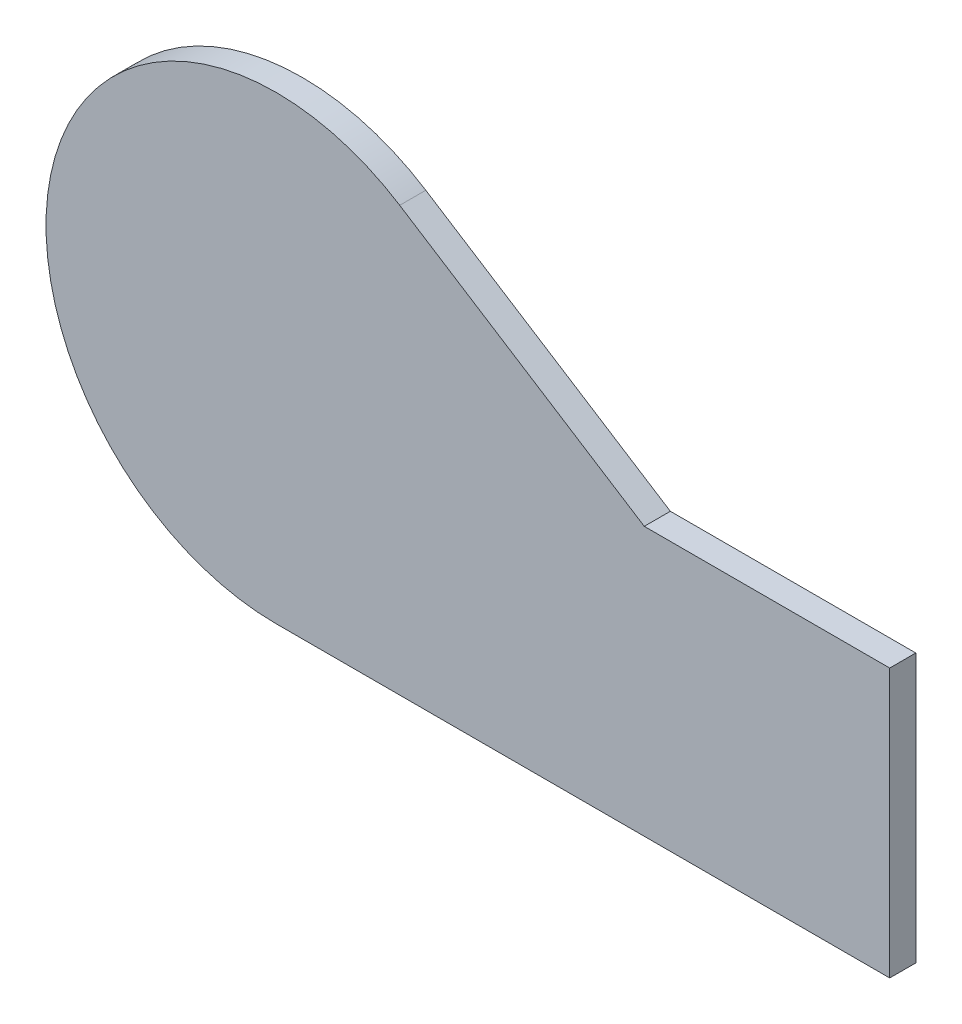
ISO-10303-21;
HEADER;
FILE_DESCRIPTION(('STEP AP214'),'2;1');
FILE_NAME('part.step','',(''),(''),'','','');
FILE_SCHEMA(('AUTOMOTIVE_DESIGN { 1 0 10303 214 1 1 1 1 }'));
ENDSEC;
DATA;
#1=APPLICATION_CONTEXT('core data for automotive mechanical design processes');
#2=APPLICATION_PROTOCOL_DEFINITION('international standard','automotive_design',2000,#1);
#3=PRODUCT_CONTEXT('',#1,'mechanical');
#4=PRODUCT('Part','Part','',(#3));
#5=PRODUCT_RELATED_PRODUCT_CATEGORY('part','',(#4));
#6=PRODUCT_DEFINITION_FORMATION('','',#4);
#7=PRODUCT_DEFINITION_CONTEXT('part definition',#1,'design');
#8=PRODUCT_DEFINITION('design','',#6,#7);
#9=PRODUCT_DEFINITION_SHAPE('','',#8);
#10=(LENGTH_UNIT() NAMED_UNIT(*) SI_UNIT(.MILLI.,.METRE.));
#11=(NAMED_UNIT(*) PLANE_ANGLE_UNIT() SI_UNIT($,.RADIAN.));
#12=(NAMED_UNIT(*) SI_UNIT($,.STERADIAN.) SOLID_ANGLE_UNIT());
#13=UNCERTAINTY_MEASURE_WITH_UNIT(LENGTH_MEASURE(1.E-05),#10,'distance_accuracy_value','');
#14=(GEOMETRIC_REPRESENTATION_CONTEXT(3) GLOBAL_UNCERTAINTY_ASSIGNED_CONTEXT((#13)) GLOBAL_UNIT_ASSIGNED_CONTEXT((#10,
#11,#12)) REPRESENTATION_CONTEXT('',''));
#15=CARTESIAN_POINT('',(0.,0.,0.));
#16=DIRECTION('',(0.,0.,1.));
#17=DIRECTION('',(1.,0.,0.));
#18=AXIS2_PLACEMENT_3D('',#15,#16,#17);
#19=CARTESIAN_POINT('',(0.,0.,3.4));
#20=DIRECTION('',(0.,0.,-1.));
#21=DIRECTION('',(-1.,0.,0.));
#22=AXIS2_PLACEMENT_3D('',#19,#20,#21);
#23=CYLINDRICAL_SURFACE('',#22,30.);
#24=CARTESIAN_POINT('',(0.,0.,0.));
#25=DIRECTION('',(0.,0.,1.));
#26=DIRECTION('',(1.,0.,0.));
#27=AXIS2_PLACEMENT_3D('',#24,#25,#26);
#28=CIRCLE('',#27,30.);
#29=CARTESIAN_POINT('',(16.1140758044522,25.3048722772585,0.));
#30=VERTEX_POINT('',#29);
#31=CARTESIAN_POINT('',(0.,-30.,0.));
#32=VERTEX_POINT('',#31);
#33=EDGE_CURVE('E111',#30,#32,#28,.T.);
#34=ORIENTED_EDGE('',*,*,#33,.T.);
#35=DIRECTION('',(0.,0.,-1.));
#36=VECTOR('',#35,1.);
#37=CARTESIAN_POINT('',(0.,-30.,3.4));
#38=LINE('',#37,#36);
#39=CARTESIAN_POINT('',(0.,-30.,3.4));
#40=VERTEX_POINT('',#39);
#41=EDGE_CURVE('E11',#40,#32,#38,.T.);
#42=ORIENTED_EDGE('',*,*,#41,.F.);
#43=CARTESIAN_POINT('',(0.,0.,3.4));
#44=DIRECTION('',(0.,0.,1.));
#45=DIRECTION('',(1.,0.,0.));
#46=AXIS2_PLACEMENT_3D('',#43,#44,#45);
#47=CIRCLE('',#46,30.);
#48=CARTESIAN_POINT('',(16.1140758044522,25.3048722772585,3.4));
#49=VERTEX_POINT('',#48);
#50=EDGE_CURVE('E119',#49,#40,#47,.T.);
#51=ORIENTED_EDGE('',*,*,#50,.F.);
#52=DIRECTION('',(0.,0.,-1.));
#53=VECTOR('',#52,1.);
#54=CARTESIAN_POINT('',(16.1140758044522,25.3048722772585,3.4));
#55=LINE('',#54,#53);
#56=EDGE_CURVE('E107',#49,#30,#55,.T.);
#57=ORIENTED_EDGE('',*,*,#56,.T.);
#58=EDGE_LOOP('',(#34,#42,#51,#57));
#59=FACE_BOUND('',#58,.T.);
#60=ADVANCED_FACE('F37',(#59),#23,.T.);
#61=CARTESIAN_POINT('',(0.,-30.,3.4));
#62=DIRECTION('',(0.,1.,0.));
#63=DIRECTION('',(-1.,0.,0.));
#64=AXIS2_PLACEMENT_3D('',#61,#62,#63);
#65=PLANE('',#64);
#66=DIRECTION('',(1.,0.,0.));
#67=VECTOR('',#66,1.);
#68=CARTESIAN_POINT('',(0.,-30.,0.));
#69=LINE('',#68,#67);
#70=CARTESIAN_POINT('',(80.,-30.,0.));
#71=VERTEX_POINT('',#70);
#72=EDGE_CURVE('E114',#32,#71,#69,.T.);
#73=ORIENTED_EDGE('',*,*,#72,.T.);
#74=DIRECTION('',(0.,0.,-1.));
#75=VECTOR('',#74,1.);
#76=CARTESIAN_POINT('',(80.,-30.,3.4));
#77=LINE('',#76,#75);
#78=CARTESIAN_POINT('',(80.,-30.,3.4));
#79=VERTEX_POINT('',#78);
#80=EDGE_CURVE('E45',#79,#71,#77,.T.);
#81=ORIENTED_EDGE('',*,*,#80,.F.);
#82=DIRECTION('',(1.,0.,0.));
#83=VECTOR('',#82,1.);
#84=CARTESIAN_POINT('',(0.,-30.,3.4));
#85=LINE('',#84,#83);
#86=EDGE_CURVE('E87',#40,#79,#85,.T.);
#87=ORIENTED_EDGE('',*,*,#86,.F.);
#88=ORIENTED_EDGE('',*,*,#41,.T.);
#89=EDGE_LOOP('',(#73,#81,#87,#88));
#90=FACE_BOUND('',#89,.T.);
#91=ADVANCED_FACE('F138',(#90),#65,.F.);
#92=CARTESIAN_POINT('',(80.,-30.,3.4));
#93=DIRECTION('',(-1.,0.,0.));
#94=DIRECTION('',(0.,0.,1.));
#95=AXIS2_PLACEMENT_3D('',#92,#93,#94);
#96=PLANE('',#95);
#97=DIRECTION('',(0.,1.,0.));
#98=VECTOR('',#97,1.);
#99=CARTESIAN_POINT('',(80.,-30.,0.));
#100=LINE('',#99,#98);
#101=CARTESIAN_POINT('',(80.,5.,0.));
#102=VERTEX_POINT('',#101);
#103=EDGE_CURVE('E102',#71,#102,#100,.T.);
#104=ORIENTED_EDGE('',*,*,#103,.T.);
#105=DIRECTION('',(0.,0.,-1.));
#106=VECTOR('',#105,1.);
#107=CARTESIAN_POINT('',(80.,5.,3.4));
#108=LINE('',#107,#106);
#109=CARTESIAN_POINT('',(80.,5.,3.4));
#110=VERTEX_POINT('',#109);
#111=EDGE_CURVE('E99',#110,#102,#108,.T.);
#112=ORIENTED_EDGE('',*,*,#111,.F.);
#113=DIRECTION('',(0.,1.,0.));
#114=VECTOR('',#113,1.);
#115=CARTESIAN_POINT('',(80.,-30.,3.4));
#116=LINE('',#115,#114);
#117=EDGE_CURVE('E91',#79,#110,#116,.T.);
#118=ORIENTED_EDGE('',*,*,#117,.F.);
#119=ORIENTED_EDGE('',*,*,#80,.T.);
#120=EDGE_LOOP('',(#104,#112,#118,#119));
#121=FACE_BOUND('',#120,.T.);
#122=ADVANCED_FACE('F100',(#121),#96,.F.);
#123=CARTESIAN_POINT('',(80.,5.,3.4));
#124=DIRECTION('',(0.,-1.,0.));
#125=DIRECTION('',(1.,0.,0.));
#126=AXIS2_PLACEMENT_3D('',#123,#124,#125);
#127=PLANE('',#126);
#128=DIRECTION('',(-1.,0.,0.));
#129=VECTOR('',#128,1.);
#130=CARTESIAN_POINT('',(80.,5.,0.));
#131=LINE('',#130,#129);
#132=CARTESIAN_POINT('',(48.,5.,0.));
#133=VERTEX_POINT('',#132);
#134=EDGE_CURVE('E73',#102,#133,#131,.T.);
#135=ORIENTED_EDGE('',*,*,#134,.T.);
#136=DIRECTION('',(0.,0.,-1.));
#137=VECTOR('',#136,1.);
#138=CARTESIAN_POINT('',(48.,5.,3.4));
#139=LINE('',#138,#137);
#140=CARTESIAN_POINT('',(48.,5.,3.4));
#141=VERTEX_POINT('',#140);
#142=EDGE_CURVE('E103',#141,#133,#139,.T.);
#143=ORIENTED_EDGE('',*,*,#142,.F.);
#144=DIRECTION('',(-1.,0.,0.));
#145=VECTOR('',#144,1.);
#146=CARTESIAN_POINT('',(80.,5.,3.4));
#147=LINE('',#146,#145);
#148=EDGE_CURVE('E95',#110,#141,#147,.T.);
#149=ORIENTED_EDGE('',*,*,#148,.F.);
#150=ORIENTED_EDGE('',*,*,#111,.T.);
#151=EDGE_LOOP('',(#135,#143,#149,#150));
#152=FACE_BOUND('',#151,.T.);
#153=ADVANCED_FACE('F105',(#152),#127,.F.);
#154=CARTESIAN_POINT('',(48.,5.,3.4));
#155=DIRECTION('',(-0.537135860148408,-0.843495742575284,0.));
#156=DIRECTION('',(0.843495742575284,-0.537135860148408,0.));
#157=AXIS2_PLACEMENT_3D('',#154,#155,#156);
#158=PLANE('',#157);
#159=DIRECTION('',(-0.843495742575284,0.537135860148408,0.));
#160=VECTOR('',#159,1.);
#161=CARTESIAN_POINT('',(48.,5.,0.));
#162=LINE('',#161,#160);
#163=EDGE_CURVE('E79',#133,#30,#162,.T.);
#164=ORIENTED_EDGE('',*,*,#163,.T.);
#165=ORIENTED_EDGE('',*,*,#56,.F.);
#166=DIRECTION('',(-0.843495742575284,0.537135860148408,0.));
#167=VECTOR('',#166,1.);
#168=CARTESIAN_POINT('',(48.,5.,3.4));
#169=LINE('',#168,#167);
#170=EDGE_CURVE('E53',#141,#49,#169,.T.);
#171=ORIENTED_EDGE('',*,*,#170,.F.);
#172=ORIENTED_EDGE('',*,*,#142,.T.);
#173=EDGE_LOOP('',(#164,#165,#171,#172));
#174=FACE_BOUND('',#173,.T.);
#175=ADVANCED_FACE('F127',(#174),#158,.F.);
#176=CARTESIAN_POINT('',(0.,0.,3.4));
#177=DIRECTION('',(0.,0.,1.));
#178=DIRECTION('',(1.,0.,0.));
#179=AXIS2_PLACEMENT_3D('',#176,#177,#178);
#180=PLANE('',#179);
#181=ORIENTED_EDGE('',*,*,#50,.T.);
#182=ORIENTED_EDGE('',*,*,#86,.T.);
#183=ORIENTED_EDGE('',*,*,#117,.T.);
#184=ORIENTED_EDGE('',*,*,#148,.T.);
#185=ORIENTED_EDGE('',*,*,#170,.T.);
#186=EDGE_LOOP('',(#181,#182,#183,#184,#185));
#187=FACE_BOUND('',#186,.T.);
#188=ADVANCED_FACE('F93',(#187),#180,.T.);
#189=CARTESIAN_POINT('',(0.,0.,0.));
#190=DIRECTION('',(0.,0.,1.));
#191=DIRECTION('',(1.,0.,0.));
#192=AXIS2_PLACEMENT_3D('',#189,#190,#191);
#193=PLANE('',#192);
#194=ORIENTED_EDGE('',*,*,#33,.F.);
#195=ORIENTED_EDGE('',*,*,#163,.F.);
#196=ORIENTED_EDGE('',*,*,#134,.F.);
#197=ORIENTED_EDGE('',*,*,#103,.F.);
#198=ORIENTED_EDGE('',*,*,#72,.F.);
#199=EDGE_LOOP('',(#194,#195,#196,#197,#198));
#200=FACE_BOUND('',#199,.T.);
#201=ADVANCED_FACE('F123',(#200),#193,.F.);
#202=CLOSED_SHELL('',(#60,#91,#122,#153,#175,#188,#201));
#203=MANIFOLD_SOLID_BREP('B2',#202);
#204=ADVANCED_BREP_SHAPE_REPRESENTATION('',(#18,#203),#14);
#205=SHAPE_DEFINITION_REPRESENTATION(#9,#204);
ENDSEC;
END-ISO-10303-21;
